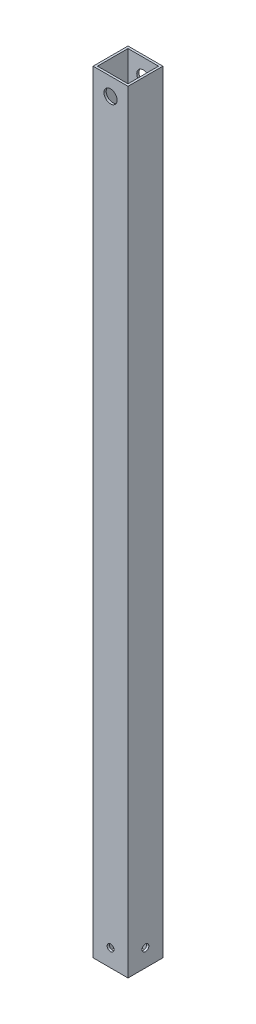
ISO-10303-21;
HEADER;
FILE_DESCRIPTION(('STEP AP214'),'2;1');
FILE_NAME('part.step','',(''),(''),'','','');
FILE_SCHEMA(('AUTOMOTIVE_DESIGN { 1 0 10303 214 1 1 1 1 }'));
ENDSEC;
DATA;
#1=APPLICATION_CONTEXT('core data for automotive mechanical design processes');
#2=APPLICATION_PROTOCOL_DEFINITION('international standard','automotive_design',2000,#1);
#3=PRODUCT_CONTEXT('',#1,'mechanical');
#4=PRODUCT('Part','Part','',(#3));
#5=PRODUCT_RELATED_PRODUCT_CATEGORY('part','',(#4));
#6=PRODUCT_DEFINITION_FORMATION('','',#4);
#7=PRODUCT_DEFINITION_CONTEXT('part definition',#1,'design');
#8=PRODUCT_DEFINITION('design','',#6,#7);
#9=PRODUCT_DEFINITION_SHAPE('','',#8);
#10=(LENGTH_UNIT() NAMED_UNIT(*) SI_UNIT(.MILLI.,.METRE.));
#11=(NAMED_UNIT(*) PLANE_ANGLE_UNIT() SI_UNIT($,.RADIAN.));
#12=(NAMED_UNIT(*) SI_UNIT($,.STERADIAN.) SOLID_ANGLE_UNIT());
#13=UNCERTAINTY_MEASURE_WITH_UNIT(LENGTH_MEASURE(1.E-05),#10,'distance_accuracy_value','');
#14=(GEOMETRIC_REPRESENTATION_CONTEXT(3) GLOBAL_UNCERTAINTY_ASSIGNED_CONTEXT((#13)) GLOBAL_UNIT_ASSIGNED_CONTEXT((#10,
#11,#12)) REPRESENTATION_CONTEXT('',''));
#15=CARTESIAN_POINT('',(0.,0.,0.));
#16=DIRECTION('',(0.,0.,1.));
#17=DIRECTION('',(1.,0.,0.));
#18=AXIS2_PLACEMENT_3D('',#15,#16,#17);
#19=CARTESIAN_POINT('',(-12.7,-268.2875,0.));
#20=DIRECTION('',(1.,0.,0.));
#21=DIRECTION('',(0.,0.,-1.));
#22=AXIS2_PLACEMENT_3D('',#19,#20,#21);
#23=CYLINDRICAL_SURFACE('',#22,2.4892);
#24=DIRECTION('',(1.,0.,0.));
#25=VECTOR('',#24,1.);
#26=CARTESIAN_POINT('',(-12.7,-268.2875,2.4892));
#27=LINE('',#26,#25);
#28=CARTESIAN_POINT('',(11.1125,-268.2875,2.4892));
#29=VERTEX_POINT('',#28);
#30=CARTESIAN_POINT('',(12.7,-268.2875,2.4892));
#31=VERTEX_POINT('',#30);
#32=EDGE_CURVE('E276',#29,#31,#27,.T.);
#33=ORIENTED_EDGE('',*,*,#32,.F.);
#34=CARTESIAN_POINT('',(11.1125,-268.2875,0.));
#35=DIRECTION('',(-1.,0.,0.));
#36=DIRECTION('',(0.,0.,1.));
#37=AXIS2_PLACEMENT_3D('',#34,#35,#36);
#38=CIRCLE('',#37,2.4892);
#39=CARTESIAN_POINT('',(11.1125,-268.2875,-2.4892));
#40=VERTEX_POINT('',#39);
#41=EDGE_CURVE('E219',#29,#40,#38,.T.);
#42=ORIENTED_EDGE('',*,*,#41,.T.);
#43=DIRECTION('',(1.,0.,0.));
#44=VECTOR('',#43,1.);
#45=CARTESIAN_POINT('',(-12.7,-268.2875,-2.4892));
#46=LINE('',#45,#44);
#47=CARTESIAN_POINT('',(12.7,-268.2875,-2.4892));
#48=VERTEX_POINT('',#47);
#49=EDGE_CURVE('E186',#40,#48,#46,.T.);
#50=ORIENTED_EDGE('',*,*,#49,.T.);
#51=CARTESIAN_POINT('',(12.7,-268.2875,0.));
#52=DIRECTION('',(1.,0.,0.));
#53=DIRECTION('',(0.,0.,-1.));
#54=AXIS2_PLACEMENT_3D('',#51,#52,#53);
#55=CIRCLE('',#54,2.4892);
#56=EDGE_CURVE('E227',#48,#31,#55,.T.);
#57=ORIENTED_EDGE('',*,*,#56,.T.);
#58=EDGE_LOOP('',(#33,#42,#50,#57));
#59=FACE_BOUND('',#58,.T.);
#60=ADVANCED_FACE('F17',(#59),#23,.F.);
#61=CARTESIAN_POINT('',(-12.7,-268.2875,0.));
#62=DIRECTION('',(1.,0.,0.));
#63=DIRECTION('',(0.,0.,-1.));
#64=AXIS2_PLACEMENT_3D('',#61,#62,#63);
#65=CYLINDRICAL_SURFACE('',#64,2.4892);
#66=DIRECTION('',(1.,0.,0.));
#67=VECTOR('',#66,1.);
#68=CARTESIAN_POINT('',(-12.7,-268.2875,2.4892));
#69=LINE('',#68,#67);
#70=CARTESIAN_POINT('',(-12.7,-268.2875,2.4892));
#71=VERTEX_POINT('',#70);
#72=CARTESIAN_POINT('',(-11.1125,-268.2875,2.4892));
#73=VERTEX_POINT('',#72);
#74=EDGE_CURVE('E247',#71,#73,#69,.T.);
#75=ORIENTED_EDGE('',*,*,#74,.F.);
#76=CARTESIAN_POINT('',(-12.7,-268.2875,0.));
#77=DIRECTION('',(1.,0.,0.));
#78=DIRECTION('',(0.,0.,-1.));
#79=AXIS2_PLACEMENT_3D('',#76,#77,#78);
#80=CIRCLE('',#79,2.4892);
#81=CARTESIAN_POINT('',(-12.7,-268.2875,-2.4892));
#82=VERTEX_POINT('',#81);
#83=EDGE_CURVE('E283',#82,#71,#80,.T.);
#84=ORIENTED_EDGE('',*,*,#83,.F.);
#85=DIRECTION('',(1.,0.,0.));
#86=VECTOR('',#85,1.);
#87=CARTESIAN_POINT('',(-12.7,-268.2875,-2.4892));
#88=LINE('',#87,#86);
#89=CARTESIAN_POINT('',(-11.1125,-268.2875,-2.4892));
#90=VERTEX_POINT('',#89);
#91=EDGE_CURVE('E213',#82,#90,#88,.T.);
#92=ORIENTED_EDGE('',*,*,#91,.T.);
#93=CARTESIAN_POINT('',(-11.1125,-268.2875,0.));
#94=DIRECTION('',(1.,0.,0.));
#95=DIRECTION('',(0.,0.,-1.));
#96=AXIS2_PLACEMENT_3D('',#93,#94,#95);
#97=CIRCLE('',#96,2.4892);
#98=EDGE_CURVE('E228',#90,#73,#97,.T.);
#99=ORIENTED_EDGE('',*,*,#98,.T.);
#100=EDGE_LOOP('',(#75,#84,#92,#99));
#101=FACE_BOUND('',#100,.T.);
#102=ADVANCED_FACE('F414',(#101),#65,.F.);
#103=CARTESIAN_POINT('',(0.,-268.2875,-12.7));
#104=DIRECTION('',(0.,0.,1.));
#105=DIRECTION('',(1.,0.,0.));
#106=AXIS2_PLACEMENT_3D('',#103,#104,#105);
#107=CYLINDRICAL_SURFACE('',#106,2.4892);
#108=DIRECTION('',(0.,0.,1.));
#109=VECTOR('',#108,1.);
#110=CARTESIAN_POINT('',(-2.48919999999994,-268.2875,-12.7));
#111=LINE('',#110,#109);
#112=CARTESIAN_POINT('',(-2.48919999999994,-268.2875,-12.7));
#113=VERTEX_POINT('',#112);
#114=CARTESIAN_POINT('',(-2.48919999999994,-268.2875,-11.1125));
#115=VERTEX_POINT('',#114);
#116=EDGE_CURVE('E310',#113,#115,#111,.T.);
#117=ORIENTED_EDGE('',*,*,#116,.F.);
#118=CARTESIAN_POINT('',(0.,-268.2875,-12.7));
#119=DIRECTION('',(0.,0.,1.));
#120=DIRECTION('',(1.,0.,0.));
#121=AXIS2_PLACEMENT_3D('',#118,#119,#120);
#122=CIRCLE('',#121,2.4892);
#123=CARTESIAN_POINT('',(2.48920000000007,-268.2875,-12.7));
#124=VERTEX_POINT('',#123);
#125=EDGE_CURVE('E159',#124,#113,#122,.T.);
#126=ORIENTED_EDGE('',*,*,#125,.F.);
#127=DIRECTION('',(0.,0.,1.));
#128=VECTOR('',#127,1.);
#129=CARTESIAN_POINT('',(2.48920000000007,-268.2875,-12.7));
#130=LINE('',#129,#128);
#131=CARTESIAN_POINT('',(2.48920000000007,-268.2875,-11.1125));
#132=VERTEX_POINT('',#131);
#133=EDGE_CURVE('E175',#124,#132,#130,.T.);
#134=ORIENTED_EDGE('',*,*,#133,.T.);
#135=CARTESIAN_POINT('',(0.,-268.2875,-11.1125));
#136=DIRECTION('',(0.,0.,1.));
#137=DIRECTION('',(1.,0.,0.));
#138=AXIS2_PLACEMENT_3D('',#135,#136,#137);
#139=CIRCLE('',#138,2.4892);
#140=EDGE_CURVE('E242',#132,#115,#139,.T.);
#141=ORIENTED_EDGE('',*,*,#140,.T.);
#142=EDGE_LOOP('',(#117,#126,#134,#141));
#143=FACE_BOUND('',#142,.T.);
#144=ADVANCED_FACE('F420',(#143),#107,.F.);
#145=CARTESIAN_POINT('',(0.,268.2875,-12.7));
#146=DIRECTION('',(0.,0.,1.));
#147=DIRECTION('',(1.,0.,0.));
#148=AXIS2_PLACEMENT_3D('',#145,#146,#147);
#149=CYLINDRICAL_SURFACE('',#148,4.7625);
#150=DIRECTION('',(0.,0.,1.));
#151=VECTOR('',#150,1.);
#152=CARTESIAN_POINT('',(-4.7625,268.2875,-12.7));
#153=LINE('',#152,#151);
#154=CARTESIAN_POINT('',(-4.7625,268.2875,-12.7));
#155=VERTEX_POINT('',#154);
#156=CARTESIAN_POINT('',(-4.7625,268.2875,-11.1125));
#157=VERTEX_POINT('',#156);
#158=EDGE_CURVE('E162',#155,#157,#153,.T.);
#159=ORIENTED_EDGE('',*,*,#158,.F.);
#160=CARTESIAN_POINT('',(0.,268.2875,-12.7));
#161=DIRECTION('',(0.,0.,1.));
#162=DIRECTION('',(1.,0.,0.));
#163=AXIS2_PLACEMENT_3D('',#160,#161,#162);
#164=CIRCLE('',#163,4.7625);
#165=CARTESIAN_POINT('',(4.7625,268.2875,-12.7));
#166=VERTEX_POINT('',#165);
#167=EDGE_CURVE('E148',#166,#155,#164,.T.);
#168=ORIENTED_EDGE('',*,*,#167,.F.);
#169=DIRECTION('',(0.,0.,1.));
#170=VECTOR('',#169,1.);
#171=CARTESIAN_POINT('',(4.7625,268.2875,-12.7));
#172=LINE('',#171,#170);
#173=CARTESIAN_POINT('',(4.7625,268.2875,-11.1125));
#174=VERTEX_POINT('',#173);
#175=EDGE_CURVE('E173',#166,#174,#172,.T.);
#176=ORIENTED_EDGE('',*,*,#175,.T.);
#177=CARTESIAN_POINT('',(0.,268.2875,-11.1125));
#178=DIRECTION('',(0.,0.,1.));
#179=DIRECTION('',(1.,0.,0.));
#180=AXIS2_PLACEMENT_3D('',#177,#178,#179);
#181=CIRCLE('',#180,4.7625);
#182=EDGE_CURVE('E165',#174,#157,#181,.T.);
#183=ORIENTED_EDGE('',*,*,#182,.T.);
#184=EDGE_LOOP('',(#159,#168,#176,#183));
#185=FACE_BOUND('',#184,.T.);
#186=ADVANCED_FACE('F163',(#185),#149,.F.);
#187=CARTESIAN_POINT('',(0.,-268.2875,-12.7));
#188=DIRECTION('',(0.,0.,1.));
#189=DIRECTION('',(1.,0.,0.));
#190=AXIS2_PLACEMENT_3D('',#187,#188,#189);
#191=CYLINDRICAL_SURFACE('',#190,2.4892);
#192=DIRECTION('',(0.,0.,1.));
#193=VECTOR('',#192,1.);
#194=CARTESIAN_POINT('',(-2.48919999999994,-268.2875,-12.7));
#195=LINE('',#194,#193);
#196=CARTESIAN_POINT('',(-2.48919999999994,-268.2875,11.1125));
#197=VERTEX_POINT('',#196);
#198=CARTESIAN_POINT('',(-2.48919999999994,-268.2875,12.7));
#199=VERTEX_POINT('',#198);
#200=EDGE_CURVE('E252',#197,#199,#195,.T.);
#201=ORIENTED_EDGE('',*,*,#200,.F.);
#202=CARTESIAN_POINT('',(0.,-268.2875,11.1125));
#203=DIRECTION('',(0.,0.,-1.));
#204=DIRECTION('',(-1.,0.,0.));
#205=AXIS2_PLACEMENT_3D('',#202,#203,#204);
#206=CIRCLE('',#205,2.4892);
#207=CARTESIAN_POINT('',(2.48920000000007,-268.2875,11.1125));
#208=VERTEX_POINT('',#207);
#209=EDGE_CURVE('E27',#197,#208,#206,.T.);
#210=ORIENTED_EDGE('',*,*,#209,.T.);
#211=DIRECTION('',(0.,0.,1.));
#212=VECTOR('',#211,1.);
#213=CARTESIAN_POINT('',(2.48920000000007,-268.2875,-12.7));
#214=LINE('',#213,#212);
#215=CARTESIAN_POINT('',(2.48920000000007,-268.2875,12.7));
#216=VERTEX_POINT('',#215);
#217=EDGE_CURVE('E188',#208,#216,#214,.T.);
#218=ORIENTED_EDGE('',*,*,#217,.T.);
#219=CARTESIAN_POINT('',(0.,-268.2875,12.7));
#220=DIRECTION('',(0.,0.,1.));
#221=DIRECTION('',(1.,0.,0.));
#222=AXIS2_PLACEMENT_3D('',#219,#220,#221);
#223=CIRCLE('',#222,2.4892);
#224=EDGE_CURVE('E279',#216,#199,#223,.T.);
#225=ORIENTED_EDGE('',*,*,#224,.T.);
#226=EDGE_LOOP('',(#201,#210,#218,#225));
#227=FACE_BOUND('',#226,.T.);
#228=ADVANCED_FACE('F536',(#227),#191,.F.);
#229=CARTESIAN_POINT('',(0.,268.2875,-12.7));
#230=DIRECTION('',(0.,0.,1.));
#231=DIRECTION('',(1.,0.,0.));
#232=AXIS2_PLACEMENT_3D('',#229,#230,#231);
#233=CYLINDRICAL_SURFACE('',#232,4.7625);
#234=DIRECTION('',(0.,0.,1.));
#235=VECTOR('',#234,1.);
#236=CARTESIAN_POINT('',(-4.7625,268.2875,-12.7));
#237=LINE('',#236,#235);
#238=CARTESIAN_POINT('',(-4.7625,268.2875,11.1125));
#239=VERTEX_POINT('',#238);
#240=CARTESIAN_POINT('',(-4.7625,268.2875,12.7));
#241=VERTEX_POINT('',#240);
#242=EDGE_CURVE('E204',#239,#241,#237,.T.);
#243=ORIENTED_EDGE('',*,*,#242,.F.);
#244=CARTESIAN_POINT('',(0.,268.2875,11.1125));
#245=DIRECTION('',(0.,0.,-1.));
#246=DIRECTION('',(-1.,0.,0.));
#247=AXIS2_PLACEMENT_3D('',#244,#245,#246);
#248=CIRCLE('',#247,4.7625);
#249=CARTESIAN_POINT('',(4.7625,268.2875,11.1125));
#250=VERTEX_POINT('',#249);
#251=EDGE_CURVE('E11',#239,#250,#248,.T.);
#252=ORIENTED_EDGE('',*,*,#251,.T.);
#253=DIRECTION('',(0.,0.,1.));
#254=VECTOR('',#253,1.);
#255=CARTESIAN_POINT('',(4.7625,268.2875,-12.7));
#256=LINE('',#255,#254);
#257=CARTESIAN_POINT('',(4.7625,268.2875,12.7));
#258=VERTEX_POINT('',#257);
#259=EDGE_CURVE('E203',#250,#258,#256,.T.);
#260=ORIENTED_EDGE('',*,*,#259,.T.);
#261=CARTESIAN_POINT('',(0.,268.2875,12.7));
#262=DIRECTION('',(0.,0.,1.));
#263=DIRECTION('',(1.,0.,0.));
#264=AXIS2_PLACEMENT_3D('',#261,#262,#263);
#265=CIRCLE('',#264,4.7625);
#266=EDGE_CURVE('E20',#258,#241,#265,.T.);
#267=ORIENTED_EDGE('',*,*,#266,.T.);
#268=EDGE_LOOP('',(#243,#252,#260,#267));
#269=FACE_BOUND('',#268,.T.);
#270=ADVANCED_FACE('F538',(#269),#233,.F.);
#271=CARTESIAN_POINT('',(0.,280.9875,11.1125));
#272=DIRECTION('',(0.,0.,-1.));
#273=DIRECTION('',(0.,-1.,0.));
#274=AXIS2_PLACEMENT_3D('',#271,#272,#273);
#275=PLANE('',#274);
#276=CARTESIAN_POINT('',(0.,268.2875,11.1125));
#277=DIRECTION('',(0.,0.,-1.));
#278=DIRECTION('',(-1.,0.,0.));
#279=AXIS2_PLACEMENT_3D('',#276,#277,#278);
#280=CIRCLE('',#279,4.7625);
#281=EDGE_CURVE('E192',#250,#239,#280,.T.);
#282=ORIENTED_EDGE('',*,*,#281,.F.);
#283=ORIENTED_EDGE('',*,*,#251,.F.);
#284=EDGE_LOOP('',(#282,#283));
#285=FACE_BOUND('',#284,.T.);
#286=CARTESIAN_POINT('',(0.,-268.2875,11.1125));
#287=DIRECTION('',(0.,0.,-1.));
#288=DIRECTION('',(-1.,0.,0.));
#289=AXIS2_PLACEMENT_3D('',#286,#287,#288);
#290=CIRCLE('',#289,2.4892);
#291=EDGE_CURVE('E248',#208,#197,#290,.T.);
#292=ORIENTED_EDGE('',*,*,#291,.F.);
#293=ORIENTED_EDGE('',*,*,#209,.F.);
#294=EDGE_LOOP('',(#292,#293));
#295=FACE_BOUND('',#294,.T.);
#296=DIRECTION('',(1.,0.,0.));
#297=VECTOR('',#296,1.);
#298=CARTESIAN_POINT('',(0.,-280.9875,11.1125));
#299=LINE('',#298,#297);
#300=CARTESIAN_POINT('',(-11.1125,-280.9875,11.1125));
#301=VERTEX_POINT('',#300);
#302=CARTESIAN_POINT('',(11.1125,-280.9875,11.1125));
#303=VERTEX_POINT('',#302);
#304=EDGE_CURVE('E237',#301,#303,#299,.T.);
#305=ORIENTED_EDGE('',*,*,#304,.F.);
#306=DIRECTION('',(0.,-1.,0.));
#307=VECTOR('',#306,1.);
#308=CARTESIAN_POINT('',(-11.1125,280.9875,11.1125));
#309=LINE('',#308,#307);
#310=CARTESIAN_POINT('',(-11.1125,280.9875,11.1125));
#311=VERTEX_POINT('',#310);
#312=EDGE_CURVE('E42',#311,#301,#309,.T.);
#313=ORIENTED_EDGE('',*,*,#312,.F.);
#314=DIRECTION('',(1.,0.,0.));
#315=VECTOR('',#314,1.);
#316=CARTESIAN_POINT('',(0.,280.9875,11.1125));
#317=LINE('',#316,#315);
#318=CARTESIAN_POINT('',(11.1125,280.9875,11.1125));
#319=VERTEX_POINT('',#318);
#320=EDGE_CURVE('E263',#311,#319,#317,.T.);
#321=ORIENTED_EDGE('',*,*,#320,.T.);
#322=DIRECTION('',(0.,-1.,0.));
#323=VECTOR('',#322,1.);
#324=CARTESIAN_POINT('',(11.1125,280.9875,11.1125));
#325=LINE('',#324,#323);
#326=EDGE_CURVE('E194',#319,#303,#325,.T.);
#327=ORIENTED_EDGE('',*,*,#326,.T.);
#328=EDGE_LOOP('',(#305,#313,#321,#327));
#329=FACE_BOUND('',#328,.T.);
#330=ADVANCED_FACE('F378',(#285,#295,#329),#275,.T.);
#331=CARTESIAN_POINT('',(-11.1125,280.9875,0.));
#332=DIRECTION('',(1.,0.,0.));
#333=DIRECTION('',(0.,1.,0.));
#334=AXIS2_PLACEMENT_3D('',#331,#332,#333);
#335=PLANE('',#334);
#336=ORIENTED_EDGE('',*,*,#98,.F.);
#337=CARTESIAN_POINT('',(-11.1125,-268.2875,0.));
#338=DIRECTION('',(1.,0.,0.));
#339=DIRECTION('',(0.,0.,-1.));
#340=AXIS2_PLACEMENT_3D('',#337,#338,#339);
#341=CIRCLE('',#340,2.4892);
#342=EDGE_CURVE('E218',#73,#90,#341,.T.);
#343=ORIENTED_EDGE('',*,*,#342,.F.);
#344=EDGE_LOOP('',(#336,#343));
#345=FACE_BOUND('',#344,.T.);
#346=DIRECTION('',(0.,0.,1.));
#347=VECTOR('',#346,1.);
#348=CARTESIAN_POINT('',(-11.1125,-280.9875,0.));
#349=LINE('',#348,#347);
#350=CARTESIAN_POINT('',(-11.1125,-280.9875,-11.1125));
#351=VERTEX_POINT('',#350);
#352=EDGE_CURVE('E284',#351,#301,#349,.T.);
#353=ORIENTED_EDGE('',*,*,#352,.F.);
#354=DIRECTION('',(0.,-1.,0.));
#355=VECTOR('',#354,1.);
#356=CARTESIAN_POINT('',(-11.1125,280.9875,-11.1125));
#357=LINE('',#356,#355);
#358=CARTESIAN_POINT('',(-11.1125,280.9875,-11.1125));
#359=VERTEX_POINT('',#358);
#360=EDGE_CURVE('E223',#359,#351,#357,.T.);
#361=ORIENTED_EDGE('',*,*,#360,.F.);
#362=DIRECTION('',(0.,0.,1.));
#363=VECTOR('',#362,1.);
#364=CARTESIAN_POINT('',(-11.1125,280.9875,0.));
#365=LINE('',#364,#363);
#366=EDGE_CURVE('E311',#359,#311,#365,.T.);
#367=ORIENTED_EDGE('',*,*,#366,.T.);
#368=ORIENTED_EDGE('',*,*,#312,.T.);
#369=EDGE_LOOP('',(#353,#361,#367,#368));
#370=FACE_BOUND('',#369,.T.);
#371=ADVANCED_FACE('F392',(#345,#370),#335,.T.);
#372=CARTESIAN_POINT('',(0.,280.9875,-11.1125));
#373=DIRECTION('',(0.,0.,1.));
#374=DIRECTION('',(1.,0.,0.));
#375=AXIS2_PLACEMENT_3D('',#372,#373,#374);
#376=PLANE('',#375);
#377=ORIENTED_EDGE('',*,*,#182,.F.);
#378=CARTESIAN_POINT('',(0.,268.2875,-11.1125));
#379=DIRECTION('',(0.,0.,1.));
#380=DIRECTION('',(1.,0.,0.));
#381=AXIS2_PLACEMENT_3D('',#378,#379,#380);
#382=CIRCLE('',#381,4.7625);
#383=EDGE_CURVE('E170',#157,#174,#382,.T.);
#384=ORIENTED_EDGE('',*,*,#383,.F.);
#385=EDGE_LOOP('',(#377,#384));
#386=FACE_BOUND('',#385,.T.);
#387=ORIENTED_EDGE('',*,*,#140,.F.);
#388=CARTESIAN_POINT('',(0.,-268.2875,-11.1125));
#389=DIRECTION('',(0.,0.,1.));
#390=DIRECTION('',(1.,0.,0.));
#391=AXIS2_PLACEMENT_3D('',#388,#389,#390);
#392=CIRCLE('',#391,2.4892);
#393=EDGE_CURVE('E182',#115,#132,#392,.T.);
#394=ORIENTED_EDGE('',*,*,#393,.F.);
#395=EDGE_LOOP('',(#387,#394));
#396=FACE_BOUND('',#395,.T.);
#397=DIRECTION('',(-1.,0.,0.));
#398=VECTOR('',#397,1.);
#399=CARTESIAN_POINT('',(0.,-280.9875,-11.1125));
#400=LINE('',#399,#398);
#401=CARTESIAN_POINT('',(11.1125,-280.9875,-11.1125));
#402=VERTEX_POINT('',#401);
#403=EDGE_CURVE('E288',#402,#351,#400,.T.);
#404=ORIENTED_EDGE('',*,*,#403,.F.);
#405=DIRECTION('',(0.,-1.,0.));
#406=VECTOR('',#405,1.);
#407=CARTESIAN_POINT('',(11.1125,280.9875,-11.1125));
#408=LINE('',#407,#406);
#409=CARTESIAN_POINT('',(11.1125,280.9875,-11.1125));
#410=VERTEX_POINT('',#409);
#411=EDGE_CURVE('E197',#410,#402,#408,.T.);
#412=ORIENTED_EDGE('',*,*,#411,.F.);
#413=DIRECTION('',(-1.,0.,0.));
#414=VECTOR('',#413,1.);
#415=CARTESIAN_POINT('',(0.,280.9875,-11.1125));
#416=LINE('',#415,#414);
#417=EDGE_CURVE('E264',#410,#359,#416,.T.);
#418=ORIENTED_EDGE('',*,*,#417,.T.);
#419=ORIENTED_EDGE('',*,*,#360,.T.);
#420=EDGE_LOOP('',(#404,#412,#418,#419));
#421=FACE_BOUND('',#420,.T.);
#422=ADVANCED_FACE('F396',(#386,#396,#421),#376,.T.);
#423=CARTESIAN_POINT('',(11.1125,280.9875,0.));
#424=DIRECTION('',(-1.,0.,0.));
#425=DIRECTION('',(0.,0.,1.));
#426=AXIS2_PLACEMENT_3D('',#423,#424,#425);
#427=PLANE('',#426);
#428=CARTESIAN_POINT('',(11.1125,-268.2875,0.));
#429=DIRECTION('',(-1.,0.,0.));
#430=DIRECTION('',(0.,0.,1.));
#431=AXIS2_PLACEMENT_3D('',#428,#429,#430);
#432=CIRCLE('',#431,2.4892);
#433=EDGE_CURVE('E272',#40,#29,#432,.T.);
#434=ORIENTED_EDGE('',*,*,#433,.F.);
#435=ORIENTED_EDGE('',*,*,#41,.F.);
#436=EDGE_LOOP('',(#434,#435));
#437=FACE_BOUND('',#436,.T.);
#438=DIRECTION('',(0.,0.,-1.));
#439=VECTOR('',#438,1.);
#440=CARTESIAN_POINT('',(11.1125,-280.9875,0.));
#441=LINE('',#440,#439);
#442=EDGE_CURVE('E257',#303,#402,#441,.T.);
#443=ORIENTED_EDGE('',*,*,#442,.F.);
#444=ORIENTED_EDGE('',*,*,#326,.F.);
#445=DIRECTION('',(0.,0.,-1.));
#446=VECTOR('',#445,1.);
#447=CARTESIAN_POINT('',(11.1125,280.9875,0.));
#448=LINE('',#447,#446);
#449=EDGE_CURVE('E259',#319,#410,#448,.T.);
#450=ORIENTED_EDGE('',*,*,#449,.T.);
#451=ORIENTED_EDGE('',*,*,#411,.T.);
#452=EDGE_LOOP('',(#443,#444,#450,#451));
#453=FACE_BOUND('',#452,.T.);
#454=ADVANCED_FACE('F386',(#437,#453),#427,.T.);
#455=CARTESIAN_POINT('',(-12.7,280.9875,12.7));
#456=DIRECTION('',(0.,0.,-1.));
#457=DIRECTION('',(0.,-1.,0.));
#458=AXIS2_PLACEMENT_3D('',#455,#456,#457);
#459=PLANE('',#458);
#460=ORIENTED_EDGE('',*,*,#266,.F.);
#461=CARTESIAN_POINT('',(0.,268.2875,12.7));
#462=DIRECTION('',(0.,0.,1.));
#463=DIRECTION('',(1.,0.,0.));
#464=AXIS2_PLACEMENT_3D('',#461,#462,#463);
#465=CIRCLE('',#464,4.7625);
#466=EDGE_CURVE('E208',#241,#258,#465,.T.);
#467=ORIENTED_EDGE('',*,*,#466,.F.);
#468=EDGE_LOOP('',(#460,#467));
#469=FACE_BOUND('',#468,.T.);
#470=ORIENTED_EDGE('',*,*,#224,.F.);
#471=CARTESIAN_POINT('',(0.,-268.2875,12.7));
#472=DIRECTION('',(0.,0.,1.));
#473=DIRECTION('',(1.,0.,0.));
#474=AXIS2_PLACEMENT_3D('',#471,#472,#473);
#475=CIRCLE('',#474,2.4892);
#476=EDGE_CURVE('E193',#199,#216,#475,.T.);
#477=ORIENTED_EDGE('',*,*,#476,.F.);
#478=EDGE_LOOP('',(#470,#477));
#479=FACE_BOUND('',#478,.T.);
#480=DIRECTION('',(1.,0.,0.));
#481=VECTOR('',#480,1.);
#482=CARTESIAN_POINT('',(-12.7,-280.9875,12.7));
#483=LINE('',#482,#481);
#484=CARTESIAN_POINT('',(-12.7,-280.9875,12.7));
#485=VERTEX_POINT('',#484);
#486=CARTESIAN_POINT('',(12.7,-280.9875,12.7));
#487=VERTEX_POINT('',#486);
#488=EDGE_CURVE('E327',#485,#487,#483,.T.);
#489=ORIENTED_EDGE('',*,*,#488,.T.);
#490=DIRECTION('',(0.,-1.,0.));
#491=VECTOR('',#490,1.);
#492=CARTESIAN_POINT('',(12.7,280.9875,12.7));
#493=LINE('',#492,#491);
#494=CARTESIAN_POINT('',(12.7,280.9875,12.7));
#495=VERTEX_POINT('',#494);
#496=EDGE_CURVE('E231',#495,#487,#493,.T.);
#497=ORIENTED_EDGE('',*,*,#496,.F.);
#498=DIRECTION('',(1.,0.,0.));
#499=VECTOR('',#498,1.);
#500=CARTESIAN_POINT('',(-12.7,280.9875,12.7));
#501=LINE('',#500,#499);
#502=CARTESIAN_POINT('',(-12.7,280.9875,12.7));
#503=VERTEX_POINT('',#502);
#504=EDGE_CURVE('E269',#503,#495,#501,.T.);
#505=ORIENTED_EDGE('',*,*,#504,.F.);
#506=DIRECTION('',(0.,-1.,0.));
#507=VECTOR('',#506,1.);
#508=CARTESIAN_POINT('',(-12.7,280.9875,12.7));
#509=LINE('',#508,#507);
#510=EDGE_CURVE('E158',#503,#485,#509,.T.);
#511=ORIENTED_EDGE('',*,*,#510,.T.);
#512=EDGE_LOOP('',(#489,#497,#505,#511));
#513=FACE_BOUND('',#512,.T.);
#514=ADVANCED_FACE('F406',(#469,#479,#513),#459,.F.);
#515=CARTESIAN_POINT('',(-12.7,280.9875,12.7));
#516=DIRECTION('',(1.,0.,0.));
#517=DIRECTION('',(0.,1.,0.));
#518=AXIS2_PLACEMENT_3D('',#515,#516,#517);
#519=PLANE('',#518);
#520=ORIENTED_EDGE('',*,*,#83,.T.);
#521=CARTESIAN_POINT('',(-12.7,-268.2875,0.));
#522=DIRECTION('',(1.,0.,0.));
#523=DIRECTION('',(0.,0.,-1.));
#524=AXIS2_PLACEMENT_3D('',#521,#522,#523);
#525=CIRCLE('',#524,2.4892);
#526=EDGE_CURVE('E243',#71,#82,#525,.T.);
#527=ORIENTED_EDGE('',*,*,#526,.T.);
#528=EDGE_LOOP('',(#520,#527));
#529=FACE_BOUND('',#528,.T.);
#530=DIRECTION('',(0.,0.,1.));
#531=VECTOR('',#530,1.);
#532=CARTESIAN_POINT('',(-12.7,-280.9875,12.7));
#533=LINE('',#532,#531);
#534=CARTESIAN_POINT('',(-12.7,-280.9875,-12.7));
#535=VERTEX_POINT('',#534);
#536=EDGE_CURVE('E258',#535,#485,#533,.T.);
#537=ORIENTED_EDGE('',*,*,#536,.T.);
#538=ORIENTED_EDGE('',*,*,#510,.F.);
#539=DIRECTION('',(0.,0.,1.));
#540=VECTOR('',#539,1.);
#541=CARTESIAN_POINT('',(-12.7,280.9875,12.7));
#542=LINE('',#541,#540);
#543=CARTESIAN_POINT('',(-12.7,280.9875,-12.7));
#544=VERTEX_POINT('',#543);
#545=EDGE_CURVE('E265',#544,#503,#542,.T.);
#546=ORIENTED_EDGE('',*,*,#545,.F.);
#547=DIRECTION('',(0.,-1.,0.));
#548=VECTOR('',#547,1.);
#549=CARTESIAN_POINT('',(-12.7,280.9875,-12.7));
#550=LINE('',#549,#548);
#551=EDGE_CURVE('E212',#544,#535,#550,.T.);
#552=ORIENTED_EDGE('',*,*,#551,.T.);
#553=EDGE_LOOP('',(#537,#538,#546,#552));
#554=FACE_BOUND('',#553,.T.);
#555=ADVANCED_FACE('F468',(#529,#554),#519,.F.);
#556=CARTESIAN_POINT('',(-12.7,280.9875,-12.7));
#557=DIRECTION('',(0.,0.,1.));
#558=DIRECTION('',(1.,0.,0.));
#559=AXIS2_PLACEMENT_3D('',#556,#557,#558);
#560=PLANE('',#559);
#561=ORIENTED_EDGE('',*,*,#167,.T.);
#562=CARTESIAN_POINT('',(0.,268.2875,-12.7));
#563=DIRECTION('',(0.,0.,1.));
#564=DIRECTION('',(1.,0.,0.));
#565=AXIS2_PLACEMENT_3D('',#562,#563,#564);
#566=CIRCLE('',#565,4.7625);
#567=EDGE_CURVE('E153',#155,#166,#566,.T.);
#568=ORIENTED_EDGE('',*,*,#567,.T.);
#569=EDGE_LOOP('',(#561,#568));
#570=FACE_BOUND('',#569,.T.);
#571=ORIENTED_EDGE('',*,*,#125,.T.);
#572=CARTESIAN_POINT('',(0.,-268.2875,-12.7));
#573=DIRECTION('',(0.,0.,1.));
#574=DIRECTION('',(1.,0.,0.));
#575=AXIS2_PLACEMENT_3D('',#572,#573,#574);
#576=CIRCLE('',#575,2.4892);
#577=EDGE_CURVE('E217',#113,#124,#576,.T.);
#578=ORIENTED_EDGE('',*,*,#577,.T.);
#579=EDGE_LOOP('',(#571,#578));
#580=FACE_BOUND('',#579,.T.);
#581=DIRECTION('',(-1.,0.,0.));
#582=VECTOR('',#581,1.);
#583=CARTESIAN_POINT('',(-12.7,-280.9875,-12.7));
#584=LINE('',#583,#582);
#585=CARTESIAN_POINT('',(12.7,-280.9875,-12.7));
#586=VERTEX_POINT('',#585);
#587=EDGE_CURVE('E253',#586,#535,#584,.T.);
#588=ORIENTED_EDGE('',*,*,#587,.T.);
#589=ORIENTED_EDGE('',*,*,#551,.F.);
#590=DIRECTION('',(-1.,0.,0.));
#591=VECTOR('',#590,1.);
#592=CARTESIAN_POINT('',(-12.7,280.9875,-12.7));
#593=LINE('',#592,#591);
#594=CARTESIAN_POINT('',(12.7,280.9875,-12.7));
#595=VERTEX_POINT('',#594);
#596=EDGE_CURVE('E202',#595,#544,#593,.T.);
#597=ORIENTED_EDGE('',*,*,#596,.F.);
#598=DIRECTION('',(0.,-1.,0.));
#599=VECTOR('',#598,1.);
#600=CARTESIAN_POINT('',(12.7,280.9875,-12.7));
#601=LINE('',#600,#599);
#602=EDGE_CURVE('E234',#595,#586,#601,.T.);
#603=ORIENTED_EDGE('',*,*,#602,.T.);
#604=EDGE_LOOP('',(#588,#589,#597,#603));
#605=FACE_BOUND('',#604,.T.);
#606=ADVANCED_FACE('F150',(#570,#580,#605),#560,.F.);
#607=CARTESIAN_POINT('',(12.7,280.9875,12.7));
#608=DIRECTION('',(-1.,0.,0.));
#609=DIRECTION('',(0.,0.,1.));
#610=AXIS2_PLACEMENT_3D('',#607,#608,#609);
#611=PLANE('',#610);
#612=ORIENTED_EDGE('',*,*,#56,.F.);
#613=CARTESIAN_POINT('',(12.7,-268.2875,0.));
#614=DIRECTION('',(1.,0.,0.));
#615=DIRECTION('',(0.,0.,-1.));
#616=AXIS2_PLACEMENT_3D('',#613,#614,#615);
#617=CIRCLE('',#616,2.4892);
#618=EDGE_CURVE('E322',#31,#48,#617,.T.);
#619=ORIENTED_EDGE('',*,*,#618,.F.);
#620=EDGE_LOOP('',(#612,#619));
#621=FACE_BOUND('',#620,.T.);
#622=DIRECTION('',(0.,0.,-1.));
#623=VECTOR('',#622,1.);
#624=CARTESIAN_POINT('',(12.7,-280.9875,12.7));
#625=LINE('',#624,#623);
#626=EDGE_CURVE('E314',#487,#586,#625,.T.);
#627=ORIENTED_EDGE('',*,*,#626,.T.);
#628=ORIENTED_EDGE('',*,*,#602,.F.);
#629=DIRECTION('',(0.,0.,-1.));
#630=VECTOR('',#629,1.);
#631=CARTESIAN_POINT('',(12.7,280.9875,12.7));
#632=LINE('',#631,#630);
#633=EDGE_CURVE('E198',#495,#595,#632,.T.);
#634=ORIENTED_EDGE('',*,*,#633,.F.);
#635=ORIENTED_EDGE('',*,*,#496,.T.);
#636=EDGE_LOOP('',(#627,#628,#634,#635));
#637=FACE_BOUND('',#636,.T.);
#638=ADVANCED_FACE('F481',(#621,#637),#611,.F.);
#639=CARTESIAN_POINT('',(0.,-280.9875,0.));
#640=DIRECTION('',(0.,1.,0.));
#641=DIRECTION('',(1.,0.,0.));
#642=AXIS2_PLACEMENT_3D('',#639,#640,#641);
#643=PLANE('',#642);
#644=ORIENTED_EDGE('',*,*,#442,.T.);
#645=ORIENTED_EDGE('',*,*,#403,.T.);
#646=ORIENTED_EDGE('',*,*,#352,.T.);
#647=ORIENTED_EDGE('',*,*,#304,.T.);
#648=EDGE_LOOP('',(#644,#645,#646,#647));
#649=FACE_BOUND('',#648,.T.);
#650=ORIENTED_EDGE('',*,*,#626,.F.);
#651=ORIENTED_EDGE('',*,*,#488,.F.);
#652=ORIENTED_EDGE('',*,*,#536,.F.);
#653=ORIENTED_EDGE('',*,*,#587,.F.);
#654=EDGE_LOOP('',(#650,#651,#652,#653));
#655=FACE_BOUND('',#654,.T.);
#656=ADVANCED_FACE('F389',(#649,#655),#643,.F.);
#657=CARTESIAN_POINT('',(0.,280.9875,0.));
#658=DIRECTION('',(0.,1.,0.));
#659=DIRECTION('',(1.,0.,0.));
#660=AXIS2_PLACEMENT_3D('',#657,#658,#659);
#661=PLANE('',#660);
#662=ORIENTED_EDGE('',*,*,#417,.F.);
#663=ORIENTED_EDGE('',*,*,#449,.F.);
#664=ORIENTED_EDGE('',*,*,#320,.F.);
#665=ORIENTED_EDGE('',*,*,#366,.F.);
#666=EDGE_LOOP('',(#662,#663,#664,#665));
#667=FACE_BOUND('',#666,.T.);
#668=ORIENTED_EDGE('',*,*,#633,.T.);
#669=ORIENTED_EDGE('',*,*,#596,.T.);
#670=ORIENTED_EDGE('',*,*,#545,.T.);
#671=ORIENTED_EDGE('',*,*,#504,.T.);
#672=EDGE_LOOP('',(#668,#669,#670,#671));
#673=FACE_BOUND('',#672,.T.);
#674=ADVANCED_FACE('F382',(#667,#673),#661,.T.);
#675=CARTESIAN_POINT('',(0.,268.2875,-12.7));
#676=DIRECTION('',(0.,0.,1.));
#677=DIRECTION('',(1.,0.,0.));
#678=AXIS2_PLACEMENT_3D('',#675,#676,#677);
#679=CYLINDRICAL_SURFACE('',#678,4.7625);
#680=ORIENTED_EDGE('',*,*,#281,.T.);
#681=ORIENTED_EDGE('',*,*,#242,.T.);
#682=ORIENTED_EDGE('',*,*,#466,.T.);
#683=ORIENTED_EDGE('',*,*,#259,.F.);
#684=EDGE_LOOP('',(#680,#681,#682,#683));
#685=FACE_BOUND('',#684,.T.);
#686=ADVANCED_FACE('F521',(#685),#679,.F.);
#687=CARTESIAN_POINT('',(0.,-268.2875,-12.7));
#688=DIRECTION('',(0.,0.,1.));
#689=DIRECTION('',(1.,0.,0.));
#690=AXIS2_PLACEMENT_3D('',#687,#688,#689);
#691=CYLINDRICAL_SURFACE('',#690,2.4892);
#692=ORIENTED_EDGE('',*,*,#291,.T.);
#693=ORIENTED_EDGE('',*,*,#200,.T.);
#694=ORIENTED_EDGE('',*,*,#476,.T.);
#695=ORIENTED_EDGE('',*,*,#217,.F.);
#696=EDGE_LOOP('',(#692,#693,#694,#695));
#697=FACE_BOUND('',#696,.T.);
#698=ADVANCED_FACE('F526',(#697),#691,.F.);
#699=CARTESIAN_POINT('',(0.,268.2875,-12.7));
#700=DIRECTION('',(0.,0.,1.));
#701=DIRECTION('',(1.,0.,0.));
#702=AXIS2_PLACEMENT_3D('',#699,#700,#701);
#703=CYLINDRICAL_SURFACE('',#702,4.7625);
#704=ORIENTED_EDGE('',*,*,#567,.F.);
#705=ORIENTED_EDGE('',*,*,#158,.T.);
#706=ORIENTED_EDGE('',*,*,#383,.T.);
#707=ORIENTED_EDGE('',*,*,#175,.F.);
#708=EDGE_LOOP('',(#704,#705,#706,#707));
#709=FACE_BOUND('',#708,.T.);
#710=ADVANCED_FACE('F172',(#709),#703,.F.);
#711=CARTESIAN_POINT('',(0.,-268.2875,-12.7));
#712=DIRECTION('',(0.,0.,1.));
#713=DIRECTION('',(1.,0.,0.));
#714=AXIS2_PLACEMENT_3D('',#711,#712,#713);
#715=CYLINDRICAL_SURFACE('',#714,2.4892);
#716=ORIENTED_EDGE('',*,*,#577,.F.);
#717=ORIENTED_EDGE('',*,*,#116,.T.);
#718=ORIENTED_EDGE('',*,*,#393,.T.);
#719=ORIENTED_EDGE('',*,*,#133,.F.);
#720=EDGE_LOOP('',(#716,#717,#718,#719));
#721=FACE_BOUND('',#720,.T.);
#722=ADVANCED_FACE('F507',(#721),#715,.F.);
#723=CARTESIAN_POINT('',(-12.7,-268.2875,0.));
#724=DIRECTION('',(1.,0.,0.));
#725=DIRECTION('',(0.,0.,-1.));
#726=AXIS2_PLACEMENT_3D('',#723,#724,#725);
#727=CYLINDRICAL_SURFACE('',#726,2.4892);
#728=ORIENTED_EDGE('',*,*,#526,.F.);
#729=ORIENTED_EDGE('',*,*,#74,.T.);
#730=ORIENTED_EDGE('',*,*,#342,.T.);
#731=ORIENTED_EDGE('',*,*,#91,.F.);
#732=EDGE_LOOP('',(#728,#729,#730,#731));
#733=FACE_BOUND('',#732,.T.);
#734=ADVANCED_FACE('F505',(#733),#727,.F.);
#735=CARTESIAN_POINT('',(-12.7,-268.2875,0.));
#736=DIRECTION('',(1.,0.,0.));
#737=DIRECTION('',(0.,0.,-1.));
#738=AXIS2_PLACEMENT_3D('',#735,#736,#737);
#739=CYLINDRICAL_SURFACE('',#738,2.4892);
#740=ORIENTED_EDGE('',*,*,#433,.T.);
#741=ORIENTED_EDGE('',*,*,#32,.T.);
#742=ORIENTED_EDGE('',*,*,#618,.T.);
#743=ORIENTED_EDGE('',*,*,#49,.F.);
#744=EDGE_LOOP('',(#740,#741,#742,#743));
#745=FACE_BOUND('',#744,.T.);
#746=ADVANCED_FACE('F435',(#745),#739,.F.);
#747=CLOSED_SHELL('',(#60,#102,#144,#186,#228,#270,#330,#371,#422,#454,#514,#555,#606,#638,#656,
#674,#686,#698,#710,#722,#734,#746));
#748=MANIFOLD_SOLID_BREP('B1',#747);
#749=ADVANCED_BREP_SHAPE_REPRESENTATION('',(#18,#748),#14);
#750=SHAPE_DEFINITION_REPRESENTATION(#9,#749);
ENDSEC;
END-ISO-10303-21;
